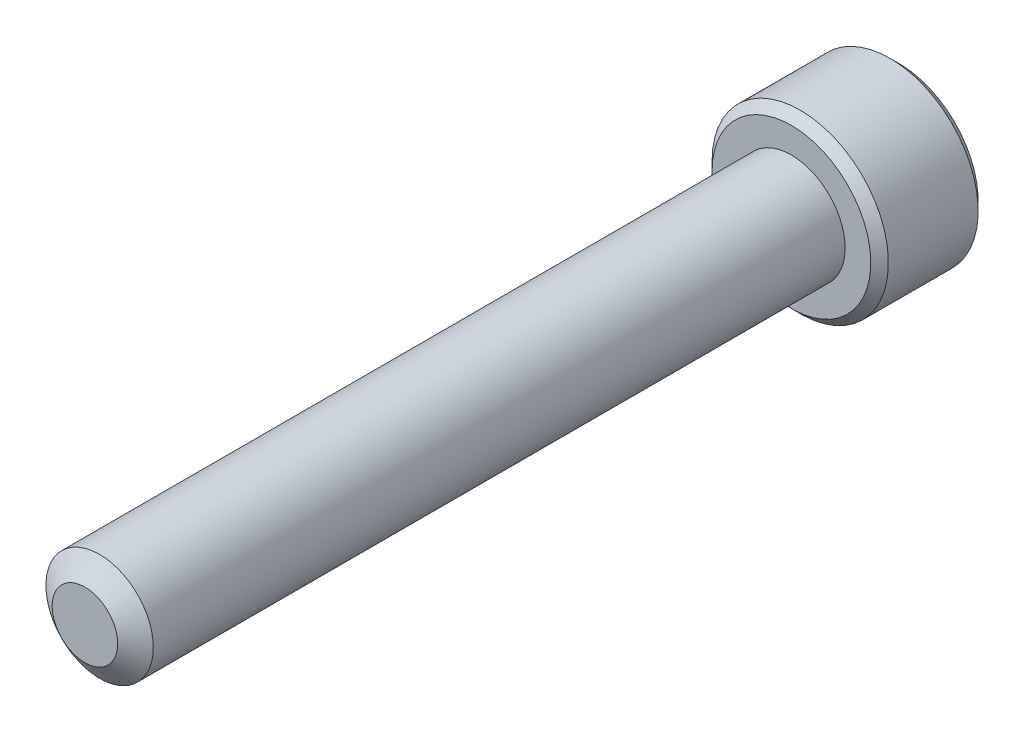
ISO-10303-21;
HEADER;
FILE_DESCRIPTION(('STEP AP214'),'2;1');
FILE_NAME('part.step','',(''),(''),'','','');
FILE_SCHEMA(('AUTOMOTIVE_DESIGN { 1 0 10303 214 1 1 1 1 }'));
ENDSEC;
DATA;
#1=APPLICATION_CONTEXT('core data for automotive mechanical design processes');
#2=APPLICATION_PROTOCOL_DEFINITION('international standard','automotive_design',2000,#1);
#3=PRODUCT_CONTEXT('',#1,'mechanical');
#4=PRODUCT('Part','Part','',(#3));
#5=PRODUCT_RELATED_PRODUCT_CATEGORY('part','',(#4));
#6=PRODUCT_DEFINITION_FORMATION('','',#4);
#7=PRODUCT_DEFINITION_CONTEXT('part definition',#1,'design');
#8=PRODUCT_DEFINITION('design','',#6,#7);
#9=PRODUCT_DEFINITION_SHAPE('','',#8);
#10=(LENGTH_UNIT() NAMED_UNIT(*) SI_UNIT(.MILLI.,.METRE.));
#11=(NAMED_UNIT(*) PLANE_ANGLE_UNIT() SI_UNIT($,.RADIAN.));
#12=(NAMED_UNIT(*) SI_UNIT($,.STERADIAN.) SOLID_ANGLE_UNIT());
#13=UNCERTAINTY_MEASURE_WITH_UNIT(LENGTH_MEASURE(1.E-05),#10,'distance_accuracy_value','');
#14=(GEOMETRIC_REPRESENTATION_CONTEXT(3) GLOBAL_UNCERTAINTY_ASSIGNED_CONTEXT((#13)) GLOBAL_UNIT_ASSIGNED_CONTEXT((#10,
#11,#12)) REPRESENTATION_CONTEXT('',''));
#15=CARTESIAN_POINT('',(0.,0.,0.));
#16=DIRECTION('',(0.,0.,1.));
#17=DIRECTION('',(1.,0.,0.));
#18=AXIS2_PLACEMENT_3D('',#15,#16,#17);
#19=CARTESIAN_POINT('',(0.,0.,-31.75));
#20=DIRECTION('',(0.,0.,1.));
#21=DIRECTION('',(1.,0.,0.));
#22=AXIS2_PLACEMENT_3D('',#19,#20,#21);
#23=CYLINDRICAL_SURFACE('',#22,2.413);
#24=CARTESIAN_POINT('',(0.,0.,-31.75));
#25=DIRECTION('',(0.,0.,-1.));
#26=DIRECTION('',(-1.,0.,0.));
#27=AXIS2_PLACEMENT_3D('',#24,#25,#26);
#28=CIRCLE('',#27,2.413);
#29=CARTESIAN_POINT('',(-2.413,0.,-31.75));
#30=VERTEX_POINT('',#29);
#31=EDGE_CURVE('E216',#30,#30,#28,.F.);
#32=ORIENTED_EDGE('',*,*,#31,.T.);
#33=EDGE_LOOP('',(#32));
#34=FACE_BOUND('',#33,.T.);
#35=CARTESIAN_POINT('',(0.,0.,-0.659180743038974));
#36=DIRECTION('',(0.,0.,1.));
#37=DIRECTION('',(1.,0.,0.));
#38=AXIS2_PLACEMENT_3D('',#35,#36,#37);
#39=CIRCLE('',#38,2.413);
#40=CARTESIAN_POINT('',(2.413,0.,-0.659180743038974));
#41=VERTEX_POINT('',#40);
#42=EDGE_CURVE('E110',#41,#41,#39,.T.);
#43=ORIENTED_EDGE('',*,*,#42,.F.);
#44=EDGE_LOOP('',(#43));
#45=FACE_BOUND('',#44,.T.);
#46=ADVANCED_FACE('F36',(#34,#45),#23,.T.);
#47=CARTESIAN_POINT('',(0.,0.,0.));
#48=DIRECTION('',(0.,0.,-1.));
#49=DIRECTION('',(-1.,0.,0.));
#50=AXIS2_PLACEMENT_3D('',#47,#48,#49);
#51=CONICAL_SURFACE('',#50,1.4715923357461,0.959931088596884);
#52=ORIENTED_EDGE('',*,*,#42,.T.);
#53=EDGE_LOOP('',(#52));
#54=FACE_BOUND('',#53,.T.);
#55=CARTESIAN_POINT('',(0.,0.,0.));
#56=DIRECTION('',(0.,0.,1.));
#57=DIRECTION('',(1.,0.,0.));
#58=AXIS2_PLACEMENT_3D('',#55,#56,#57);
#59=CIRCLE('',#58,1.4715923357461);
#60=CARTESIAN_POINT('',(1.4715923357461,0.,0.));
#61=VERTEX_POINT('',#60);
#62=EDGE_CURVE('E214',#61,#61,#59,.T.);
#63=ORIENTED_EDGE('',*,*,#62,.F.);
#64=EDGE_LOOP('',(#63));
#65=FACE_BOUND('',#64,.T.);
#66=ADVANCED_FACE('F197',(#54,#65),#51,.T.);
#67=CARTESIAN_POINT('',(0.,0.,0.));
#68=DIRECTION('',(0.,0.,1.));
#69=DIRECTION('',(1.,0.,0.));
#70=AXIS2_PLACEMENT_3D('',#67,#68,#69);
#71=PLANE('',#70);
#72=ORIENTED_EDGE('',*,*,#62,.T.);
#73=EDGE_LOOP('',(#72));
#74=FACE_BOUND('',#73,.T.);
#75=ADVANCED_FACE('F194',(#74),#71,.T.);
#76=CARTESIAN_POINT('',(0.,0.,-36.576));
#77=DIRECTION('',(0.,0.,1.));
#78=DIRECTION('',(1.,0.,0.));
#79=AXIS2_PLACEMENT_3D('',#76,#77,#78);
#80=CYLINDRICAL_SURFACE('',#79,3.9624);
#81=CARTESIAN_POINT('',(0.,0.,-36.17976));
#82=DIRECTION('',(0.,0.,-1.));
#83=DIRECTION('',(-1.,0.,0.));
#84=AXIS2_PLACEMENT_3D('',#81,#82,#83);
#85=CIRCLE('',#84,3.9624);
#86=CARTESIAN_POINT('',(-3.9624,0.,-36.17976));
#87=VERTEX_POINT('',#86);
#88=EDGE_CURVE('E44',#87,#87,#85,.F.);
#89=ORIENTED_EDGE('',*,*,#88,.T.);
#90=EDGE_LOOP('',(#89));
#91=FACE_BOUND('',#90,.T.);
#92=CARTESIAN_POINT('',(0.,0.,-32.14624));
#93=DIRECTION('',(0.,0.,-1.));
#94=DIRECTION('',(-1.,0.,0.));
#95=AXIS2_PLACEMENT_3D('',#92,#93,#94);
#96=CIRCLE('',#95,3.9624);
#97=CARTESIAN_POINT('',(-3.9624,0.,-32.14624));
#98=VERTEX_POINT('',#97);
#99=EDGE_CURVE('E173',#98,#98,#96,.T.);
#100=ORIENTED_EDGE('',*,*,#99,.T.);
#101=EDGE_LOOP('',(#100));
#102=FACE_BOUND('',#101,.T.);
#103=ADVANCED_FACE('F178',(#91,#102),#80,.T.);
#104=CARTESIAN_POINT('',(0.,0.,-36.576));
#105=DIRECTION('',(0.,0.,-1.));
#106=DIRECTION('',(-1.,0.,0.));
#107=AXIS2_PLACEMENT_3D('',#104,#105,#106);
#108=PLANE('',#107);
#109=CARTESIAN_POINT('',(0.,0.,-36.576));
#110=DIRECTION('',(0.,0.,-1.));
#111=DIRECTION('',(-1.,0.,0.));
#112=AXIS2_PLACEMENT_3D('',#109,#110,#111);
#113=CIRCLE('',#112,3.56616);
#114=CARTESIAN_POINT('',(-3.56616,0.,-36.576));
#115=VERTEX_POINT('',#114);
#116=EDGE_CURVE('E109',#115,#115,#113,.T.);
#117=ORIENTED_EDGE('',*,*,#116,.T.);
#118=EDGE_LOOP('',(#117));
#119=FACE_BOUND('',#118,.T.);
#120=CARTESIAN_POINT('',(0.,0.,-36.576));
#121=DIRECTION('',(0.,0.,-1.));
#122=DIRECTION('',(-1.,0.,0.));
#123=AXIS2_PLACEMENT_3D('',#120,#121,#122);
#124=CIRCLE('',#123,2.29135888084633);
#125=CARTESIAN_POINT('',(-1.984375,1.14567944042316,-36.576));
#126=VERTEX_POINT('',#125);
#127=CARTESIAN_POINT('',(0.,2.29135888084633,-36.576));
#128=VERTEX_POINT('',#127);
#129=EDGE_CURVE('E90',#126,#128,#124,.T.);
#130=ORIENTED_EDGE('',*,*,#129,.F.);
#131=CARTESIAN_POINT('',(-1.984375,-1.14567944042316,-36.576));
#132=VERTEX_POINT('',#131);
#133=EDGE_CURVE('E50',#132,#126,#124,.T.);
#134=ORIENTED_EDGE('',*,*,#133,.F.);
#135=CARTESIAN_POINT('',(0.,-2.29135888084633,-36.576));
#136=VERTEX_POINT('',#135);
#137=EDGE_CURVE('E275',#136,#132,#124,.T.);
#138=ORIENTED_EDGE('',*,*,#137,.F.);
#139=CARTESIAN_POINT('',(1.984375,-1.14567944042316,-36.576));
#140=VERTEX_POINT('',#139);
#141=EDGE_CURVE('E57',#140,#136,#124,.T.);
#142=ORIENTED_EDGE('',*,*,#141,.F.);
#143=CARTESIAN_POINT('',(1.984375,1.14567944042316,-36.576));
#144=VERTEX_POINT('',#143);
#145=EDGE_CURVE('E131',#144,#140,#124,.T.);
#146=ORIENTED_EDGE('',*,*,#145,.F.);
#147=EDGE_CURVE('E99',#128,#144,#124,.T.);
#148=ORIENTED_EDGE('',*,*,#147,.F.);
#149=EDGE_LOOP('',(#130,#134,#138,#142,#146,#148));
#150=FACE_BOUND('',#149,.T.);
#151=ADVANCED_FACE('F130',(#119,#150),#108,.T.);
#152=CARTESIAN_POINT('',(0.,0.,-31.75));
#153=DIRECTION('',(0.,0.,-1.));
#154=DIRECTION('',(-1.,0.,0.));
#155=AXIS2_PLACEMENT_3D('',#152,#153,#154);
#156=PLANE('',#155);
#157=CARTESIAN_POINT('',(0.,0.,-31.75));
#158=DIRECTION('',(0.,0.,-1.));
#159=DIRECTION('',(-1.,0.,0.));
#160=AXIS2_PLACEMENT_3D('',#157,#158,#159);
#161=CIRCLE('',#160,3.56616);
#162=CARTESIAN_POINT('',(-3.56616,0.,-31.75));
#163=VERTEX_POINT('',#162);
#164=EDGE_CURVE('E11',#163,#163,#161,.F.);
#165=ORIENTED_EDGE('',*,*,#164,.T.);
#166=EDGE_LOOP('',(#165));
#167=FACE_BOUND('',#166,.T.);
#168=ORIENTED_EDGE('',*,*,#31,.F.);
#169=EDGE_LOOP('',(#168));
#170=FACE_BOUND('',#169,.T.);
#171=ADVANCED_FACE('F187',(#167,#170),#156,.F.);
#172=CARTESIAN_POINT('',(0.,0.,-36.576));
#173=DIRECTION('',(0.,0.,-1.));
#174=DIRECTION('',(-1.,0.,0.));
#175=AXIS2_PLACEMENT_3D('',#172,#173,#174);
#176=CONICAL_SURFACE('',#175,2.29135888084633,0.78539816339745);
#177=ORIENTED_EDGE('',*,*,#147,.T.);
#178=CARTESIAN_POINT('',(-0.000199999999999152,2.29147435090016,-36.5761154787818));
#179=CARTESIAN_POINT('',(0.0680159951668032,2.25208982772757,-36.5367628522639));
#180=CARTESIAN_POINT('',(0.137372685106966,2.21204672412052,-36.4997213104462));
#181=CARTESIAN_POINT('',(0.278798800452186,2.13039431835551,-36.4318988584233));
#182=CARTESIAN_POINT('',(0.350881678736782,2.08877724917394,-36.4011556890918));
#183=CARTESIAN_POINT('',(0.496233397266004,2.00485839535392,-36.3484918888112));
#184=CARTESIAN_POINT('',(0.56946521248694,1.96257798712286,-36.32643887588));
#185=CARTESIAN_POINT('',(0.71754118259471,1.87708628592063,-36.2924614929439));
#186=CARTESIAN_POINT('',(0.792380812753429,1.83387760530244,-36.2805117560917));
#187=CARTESIAN_POINT('',(0.921360414543821,1.75941119748879,-36.2697300990819));
#188=CARTESIAN_POINT('',(0.975333715772447,1.72824969749539,-36.2681338990591));
#189=CARTESIAN_POINT('',(1.08319211851981,1.66597761963484,-36.2708218388653));
#190=CARTESIAN_POINT('',(1.13707718248553,1.63486706344893,-36.2751080403405));
#191=CARTESIAN_POINT('',(1.24433853824861,1.57293969082547,-36.2893168730135));
#192=CARTESIAN_POINT('',(1.29771419276014,1.54212324232506,-36.2992458104523));
#193=CARTESIAN_POINT('',(1.4035425174089,1.48102323060121,-36.3241950842745));
#194=CARTESIAN_POINT('',(1.45599525797111,1.45073962671789,-36.3392150303895));
#195=CARTESIAN_POINT('',(1.59035733896365,1.37316564308797,-36.3838078516357));
#196=CARTESIAN_POINT('',(1.67143335715833,1.32635638215845,-36.4167429959383));
#197=CARTESIAN_POINT('',(1.79064830672984,1.25752759893191,-36.4723424412022));
#198=CARTESIAN_POINT('',(1.829934924386,1.23484545965257,-36.4918775920519));
#199=CARTESIAN_POINT('',(1.90778036186805,1.18990137536713,-36.5327287381194));
#200=CARTESIAN_POINT('',(1.9463396111017,1.16763918244233,-36.5540436395683));
#201=CARTESIAN_POINT('',(1.984575,1.14556397036933,-36.5761154787818));
#202=B_SPLINE_CURVE_WITH_KNOTS('',3,(#178,#179,#180,#181,#182,#183,#184,#185,#186,#187,#188,
#189,#190,#191,#192,#193,#194,#195,#196,#197,#198,#199,#200,#201),.UNSPECIFIED.,.F.,.F.,(4,2,2,
2,2,2,2,2,2,2,2,4),(0.,0.264339630306623,0.530219665093693,0.791876416371462,1.05287424418109,
1.23963984393201,1.42647091743853,1.61351120244035,1.80053715247541,2.09764209964316,
2.24579179873713,2.39385111134157),.UNSPECIFIED.);
#203=EDGE_CURVE('E104',#128,#144,#202,.T.);
#204=ORIENTED_EDGE('',*,*,#203,.F.);
#205=EDGE_LOOP('',(#177,#204));
#206=FACE_BOUND('',#205,.T.);
#207=ADVANCED_FACE('F105',(#206),#176,.F.);
#208=ORIENTED_EDGE('',*,*,#145,.T.);
#209=CARTESIAN_POINT('',(1.984375,-2.28495242157823,-37.3109840788166));
#210=CARTESIAN_POINT('',(1.984375,-2.22931635455402,-37.2689866855508));
#211=CARTESIAN_POINT('',(1.984375,-2.1733687654839,-37.2273960540763));
#212=CARTESIAN_POINT('',(1.984375,-2.06072770258171,-37.1452084614715));
#213=CARTESIAN_POINT('',(1.984375,-2.00403404503435,-37.104611752405));
#214=CARTESIAN_POINT('',(1.984375,-1.88936329173489,-37.0243035031747));
#215=CARTESIAN_POINT('',(1.984375,-1.83137965519348,-36.9846012588133));
#216=CARTESIAN_POINT('',(1.984375,-1.71442802137841,-36.9066851734013));
#217=CARTESIAN_POINT('',(1.984375,-1.65546009407228,-36.8684712271944));
#218=CARTESIAN_POINT('',(1.984375,-1.47005472306036,-36.7522528340136));
#219=CARTESIAN_POINT('',(1.984375,-1.34163909427884,-36.6773478868724));
#220=CARTESIAN_POINT('',(1.984375,-1.0784038470548,-36.5403302154397));
#221=CARTESIAN_POINT('',(1.984375,-0.943607781407426,-36.4781743664824));
#222=CARTESIAN_POINT('',(1.984375,-0.741275100444881,-36.4021325786886));
#223=CARTESIAN_POINT('',(1.984375,-0.676735408881094,-36.380308061326));
#224=CARTESIAN_POINT('',(1.984375,-0.54609811811276,-36.3418404635378));
#225=CARTESIAN_POINT('',(1.984375,-0.480000411919954,-36.3251977400655));
#226=CARTESIAN_POINT('',(1.984375,-0.34774617002853,-36.2982353808697));
#227=CARTESIAN_POINT('',(1.984375,-0.281612071479121,-36.2878074097359));
#228=CARTESIAN_POINT('',(1.984375,-0.148636620052347,-36.2734781473766));
#229=CARTESIAN_POINT('',(1.984375,-0.0817953907393204,-36.2695757342274));
#230=CARTESIAN_POINT('',(1.984375,0.0495156750890684,-36.2685870513327));
#231=CARTESIAN_POINT('',(1.984375,0.113983775102996,-36.271259178875));
#232=CARTESIAN_POINT('',(1.984375,0.242367515846182,-36.2827392104975));
#233=CARTESIAN_POINT('',(1.984375,0.306283102295925,-36.2915477106392));
#234=CARTESIAN_POINT('',(1.984375,0.434181040262189,-36.3149690213329));
#235=CARTESIAN_POINT('',(1.984375,0.498145026858314,-36.3296806062321));
#236=CARTESIAN_POINT('',(1.984375,0.624675616953012,-36.3641261814121));
#237=CARTESIAN_POINT('',(1.984375,0.687242336899693,-36.3838597514492));
#238=CARTESIAN_POINT('',(1.984375,0.884225483826093,-36.4534122372308));
#239=CARTESIAN_POINT('',(1.984375,1.01583674256469,-36.5111524112565));
#240=CARTESIAN_POINT('',(1.984375,1.27288659242653,-36.6395303365888));
#241=CARTESIAN_POINT('',(1.984375,1.39830088270481,-36.7102144249194));
#242=CARTESIAN_POINT('',(1.984375,1.57956687990222,-36.8205166638132));
#243=CARTESIAN_POINT('',(1.984375,1.63738271299424,-36.8569698294754));
#244=CARTESIAN_POINT('',(1.984375,1.75202215386202,-36.9314159632917));
#245=CARTESIAN_POINT('',(1.984375,1.80884568601362,-36.9694090480781));
#246=CARTESIAN_POINT('',(1.984375,1.92116923084256,-37.0463388088931));
#247=CARTESIAN_POINT('',(1.984375,1.97667624512254,-37.0852653130388));
#248=CARTESIAN_POINT('',(1.984375,2.08693170717167,-37.1641477461214));
#249=CARTESIAN_POINT('',(1.984375,2.14168035934793,-37.204103389024));
#250=CARTESIAN_POINT('',(1.984375,2.19611149046623,-37.2444806112854));
#251=B_SPLINE_CURVE_WITH_KNOTS('',3,(#209,#210,#211,#212,#213,#214,#215,#216,#217,#218,#219,
#220,#221,#222,#223,#224,#225,#226,#227,#228,#229,#230,#231,#232,#233,#234,#235,#236,#237,#238,
#239,#240,#241,#242,#243,#244,#245,#246,#247,#248,#249,#250),.UNSPECIFIED.,.F.,.F.,(4,2,2,2,2,2,
2,2,2,2,2,2,2,2,2,2,2,2,2,2,4),(0.,0.20912607000832,0.418304637356568,0.629103979977992,
0.839888401371183,1.28549951116127,1.72957750768351,1.93379389749972,2.13802435186699,
2.33858179514334,2.5391047535064,2.73236963400795,2.92565329006888,3.12231577097488,
3.31896180041346,3.74886295245173,4.18033428125363,4.38536017180291,4.59040161996384,
4.79377749165109,4.99709743524133),.UNSPECIFIED.);
#252=EDGE_CURVE('E98',#144,#140,#251,.F.);
#253=ORIENTED_EDGE('',*,*,#252,.F.);
#254=EDGE_LOOP('',(#208,#253));
#255=FACE_BOUND('',#254,.T.);
#256=ADVANCED_FACE('F281',(#255),#176,.F.);
#257=ORIENTED_EDGE('',*,*,#141,.T.);
#258=CARTESIAN_POINT('',(1.984575,-1.14556397036933,-36.5761154787818));
#259=CARTESIAN_POINT('',(1.9163590048332,-1.18494849354192,-36.5367628522639));
#260=CARTESIAN_POINT('',(1.84700231489303,-1.22499159714897,-36.4997213104462));
#261=CARTESIAN_POINT('',(1.70557619954781,-1.30664400291398,-36.4318988584233));
#262=CARTESIAN_POINT('',(1.63349332126322,-1.34826107209555,-36.4011556890918));
#263=CARTESIAN_POINT('',(1.488141602734,-1.43217992591557,-36.3484918888112));
#264=CARTESIAN_POINT('',(1.41490978751306,-1.47446033414663,-36.32643887588));
#265=CARTESIAN_POINT('',(1.26683381740529,-1.55995203534886,-36.2924614929439));
#266=CARTESIAN_POINT('',(1.19199418724657,-1.60316071596705,-36.2805117560917));
#267=CARTESIAN_POINT('',(1.06301458545618,-1.6776271237807,-36.2697300990819));
#268=CARTESIAN_POINT('',(1.00904128422755,-1.7087886237741,-36.2681338990591));
#269=CARTESIAN_POINT('',(0.901182881480194,-1.77106070163465,-36.2708218388653));
#270=CARTESIAN_POINT('',(0.847297817514472,-1.80217125782056,-36.2751080403405));
#271=CARTESIAN_POINT('',(0.740036461751391,-1.86409863044402,-36.2893168730135));
#272=CARTESIAN_POINT('',(0.686660807239855,-1.89491507894443,-36.2992458104523));
#273=CARTESIAN_POINT('',(0.580832482591099,-1.95601509066828,-36.3241950842745));
#274=CARTESIAN_POINT('',(0.528379742028894,-1.9862986945516,-36.3392150303895));
#275=CARTESIAN_POINT('',(0.394017661036348,-2.06387267818152,-36.3838078516357));
#276=CARTESIAN_POINT('',(0.312941642841674,-2.11068193911104,-36.4167429959383));
#277=CARTESIAN_POINT('',(0.193726693270163,-2.17951072233758,-36.4723424412022));
#278=CARTESIAN_POINT('',(0.154440075614003,-2.20219286161692,-36.4918775920519));
#279=CARTESIAN_POINT('',(0.0765946381319523,-2.24713694590236,-36.5327287381194));
#280=CARTESIAN_POINT('',(0.0380353888983053,-2.26939913882716,-36.5540436395683));
#281=CARTESIAN_POINT('',(-0.000199999999998087,-2.29147435090016,-36.5761154787818));
#282=B_SPLINE_CURVE_WITH_KNOTS('',3,(#258,#259,#260,#261,#262,#263,#264,#265,#266,#267,#268,
#269,#270,#271,#272,#273,#274,#275,#276,#277,#278,#279,#280,#281),.UNSPECIFIED.,.F.,.F.,(4,2,2,
2,2,2,2,2,2,2,2,4),(0.,0.264339630306623,0.530219665093693,0.791876416371462,1.05287424418109,
1.23963984393201,1.42647091743853,1.61351120244035,1.80053715247541,2.09764209964316,
2.24579179873713,2.39385111134157),.UNSPECIFIED.);
#283=EDGE_CURVE('E141',#140,#136,#282,.T.);
#284=ORIENTED_EDGE('',*,*,#283,.F.);
#285=EDGE_LOOP('',(#257,#284));
#286=FACE_BOUND('',#285,.T.);
#287=ADVANCED_FACE('F278',(#286),#176,.F.);
#288=ORIENTED_EDGE('',*,*,#137,.T.);
#289=CARTESIAN_POINT('',(0.000200000000000443,-2.29147435090016,-36.5761154787818));
#290=CARTESIAN_POINT('',(-0.0680159951668036,-2.25208982772757,-36.5367628522639));
#291=CARTESIAN_POINT('',(-0.137372685106967,-2.21204672412052,-36.4997213104462));
#292=CARTESIAN_POINT('',(-0.278798800452188,-2.13039431835551,-36.4318988584233));
#293=CARTESIAN_POINT('',(-0.350881678736781,-2.08877724917394,-36.4011556890918));
#294=CARTESIAN_POINT('',(-0.496233397266002,-2.00485839535392,-36.3484918888112));
#295=CARTESIAN_POINT('',(-0.569465212486937,-1.96257798712287,-36.32643887588));
#296=CARTESIAN_POINT('',(-0.717541182594707,-1.87708628592063,-36.2924614929439));
#297=CARTESIAN_POINT('',(-0.792380812753427,-1.83387760530244,-36.2805117560917));
#298=CARTESIAN_POINT('',(-0.921360414543819,-1.75941119748879,-36.2697300990819));
#299=CARTESIAN_POINT('',(-0.975333715772446,-1.72824969749539,-36.2681338990591));
#300=CARTESIAN_POINT('',(-1.0831921185198,-1.66597761963484,-36.2708218388653));
#301=CARTESIAN_POINT('',(-1.13707718248553,-1.63486706344893,-36.2751080403405));
#302=CARTESIAN_POINT('',(-1.24433853824861,-1.57293969082547,-36.2893168730135));
#303=CARTESIAN_POINT('',(-1.29771419276014,-1.54212324232506,-36.2992458104523));
#304=CARTESIAN_POINT('',(-1.4035425174089,-1.48102323060121,-36.3241950842745));
#305=CARTESIAN_POINT('',(-1.45599525797111,-1.45073962671789,-36.3392150303895));
#306=CARTESIAN_POINT('',(-1.59035733896365,-1.37316564308797,-36.3838078516357));
#307=CARTESIAN_POINT('',(-1.67143335715833,-1.32635638215845,-36.4167429959383));
#308=CARTESIAN_POINT('',(-1.79064830672984,-1.25752759893191,-36.4723424412022));
#309=CARTESIAN_POINT('',(-1.829934924386,-1.23484545965257,-36.4918775920519));
#310=CARTESIAN_POINT('',(-1.90778036186806,-1.18990137536712,-36.5327287381194));
#311=CARTESIAN_POINT('',(-1.9463396111017,-1.16763918244233,-36.5540436395683));
#312=CARTESIAN_POINT('',(-1.984575,-1.14556397036933,-36.5761154787818));
#313=B_SPLINE_CURVE_WITH_KNOTS('',3,(#289,#290,#291,#292,#293,#294,#295,#296,#297,#298,#299,
#300,#301,#302,#303,#304,#305,#306,#307,#308,#309,#310,#311,#312),.UNSPECIFIED.,.F.,.F.,(4,2,2,
2,2,2,2,2,2,2,2,4),(0.,0.264339630306627,0.530219665093692,0.791876416371459,1.05287424418109,
1.239639843932,1.42647091743853,1.61351120244035,1.80053715247541,2.09764209964317,
2.24579179873714,2.39385111134157),.UNSPECIFIED.);
#314=EDGE_CURVE('E252',#136,#132,#313,.T.);
#315=ORIENTED_EDGE('',*,*,#314,.F.);
#316=EDGE_LOOP('',(#288,#315));
#317=FACE_BOUND('',#316,.T.);
#318=ADVANCED_FACE('F277',(#317),#176,.F.);
#319=ORIENTED_EDGE('',*,*,#133,.T.);
#320=CARTESIAN_POINT('',(-1.984375,-2.28495242191067,-37.3109840790676));
#321=CARTESIAN_POINT('',(-1.984375,-2.22931635487714,-37.2689866857921));
#322=CARTESIAN_POINT('',(-1.984375,-2.17336876579766,-37.227396054308));
#323=CARTESIAN_POINT('',(-1.984375,-2.06072770287667,-37.1452084616839));
#324=CARTESIAN_POINT('',(-1.984375,-2.00403404531986,-37.1046117526079));
#325=CARTESIAN_POINT('',(-1.984375,-1.88936329200117,-37.0243035033582));
#326=CARTESIAN_POINT('',(-1.984375,-1.83137965545,-36.9846012589872));
#327=CARTESIAN_POINT('',(-1.984375,-1.71442802161519,-36.906685173556));
#328=CARTESIAN_POINT('',(-1.984375,-1.65546009429912,-36.8684712273396));
#329=CARTESIAN_POINT('',(-1.984375,-1.47005472325436,-36.7522528341287));
#330=CARTESIAN_POINT('',(-1.984375,-1.34163909444949,-36.6773478869673));
#331=CARTESIAN_POINT('',(-1.984375,-1.07840384717678,-36.5403302154972));
#332=CARTESIAN_POINT('',(-1.984375,-0.943607781504097,-36.4781743665226));
#333=CARTESIAN_POINT('',(-1.984375,-0.741275100522508,-36.402132578716));
#334=CARTESIAN_POINT('',(-1.984375,-0.676735408966696,-36.3803080613539));
#335=CARTESIAN_POINT('',(-1.984375,-0.546098118214574,-36.3418404635651));
#336=CARTESIAN_POINT('',(-1.984375,-0.480000412030006,-36.3251977400917));
#337=CARTESIAN_POINT('',(-1.984375,-0.347746170154783,-36.2982353808918));
#338=CARTESIAN_POINT('',(-1.984375,-0.281612071613335,-36.287807409755));
#339=CARTESIAN_POINT('',(-1.984375,-0.148636620202217,-36.2734781473881));
#340=CARTESIAN_POINT('',(-1.984375,-0.0817953908968854,-36.2695757342341));
#341=CARTESIAN_POINT('',(-1.984375,0.0495156749173055,-36.2685870513286));
#342=CARTESIAN_POINT('',(-1.984375,0.11398377492471,-36.271259178865));
#343=CARTESIAN_POINT('',(-1.984375,0.242367515655504,-36.2827392104746));
#344=CARTESIAN_POINT('',(-1.984375,0.306283102099377,-36.2915477106094));
#345=CARTESIAN_POINT('',(-1.984375,0.434181040054054,-36.3149690212885));
#346=CARTESIAN_POINT('',(-1.984375,0.49814502664448,-36.3296806061801));
#347=CARTESIAN_POINT('',(-1.984375,0.624675616728327,-36.3641261813447));
#348=CARTESIAN_POINT('',(-1.984375,0.687242336669859,-36.383859751374));
#349=CARTESIAN_POINT('',(-1.984375,0.884225483546214,-36.4534122371188));
#350=CARTESIAN_POINT('',(-1.984375,1.01583674224242,-36.5111524111108));
#351=CARTESIAN_POINT('',(-1.984375,1.27288659202274,-36.6395303363718));
#352=CARTESIAN_POINT('',(-1.984375,1.39830088226191,-36.7102144246649));
#353=CARTESIAN_POINT('',(-1.984375,1.57956687940504,-36.8205166635036));
#354=CARTESIAN_POINT('',(-1.984375,1.63738271248118,-36.8569698291489));
#355=CARTESIAN_POINT('',(-1.984375,1.75202215331742,-36.9314159629313));
#356=CARTESIAN_POINT('',(-1.984375,1.80884568545336,-36.9694090477007));
#357=CARTESIAN_POINT('',(-1.984375,1.92116923025137,-37.0463388084819));
#358=CARTESIAN_POINT('',(-1.984375,1.97667624451607,-37.0852653126108));
#359=CARTESIAN_POINT('',(-1.984375,2.08693170653474,-37.1641477456598));
#360=CARTESIAN_POINT('',(-1.984375,2.14168035869582,-37.2041033885457));
#361=CARTESIAN_POINT('',(-1.984375,2.19611148979895,-37.2444806107903));
#362=B_SPLINE_CURVE_WITH_KNOTS('',3,(#320,#321,#322,#323,#324,#325,#326,#327,#328,#329,#330,
#331,#332,#333,#334,#335,#336,#337,#338,#339,#340,#341,#342,#343,#344,#345,#346,#347,#348,#349,
#350,#351,#352,#353,#354,#355,#356,#357,#358,#359,#360,#361),.UNSPECIFIED.,.F.,.F.,(4,2,2,2,2,2,
2,2,2,2,2,2,2,2,2,2,2,2,2,2,4),(0.,0.209126070048124,0.418304637436187,0.629103980098172,
0.839888401531927,1.28549951141299,1.72957750802534,1.93379389781848,2.13802435216272,
2.33858179541699,2.53910475375796,2.7323696342393,2.92565329027999,3.12231577116423,
3.31896180058103,3.74886295246282,4.1803342811072,4.38536017158909,4.59040161968263,
4.79377749130341,4.99709743482718),.UNSPECIFIED.);
#363=EDGE_CURVE('E120',#132,#126,#362,.T.);
#364=ORIENTED_EDGE('',*,*,#363,.F.);
#365=EDGE_LOOP('',(#319,#364));
#366=FACE_BOUND('',#365,.T.);
#367=ADVANCED_FACE('F290',(#366),#176,.F.);
#368=ORIENTED_EDGE('',*,*,#129,.T.);
#369=CARTESIAN_POINT('',(-1.984575,1.14556397036933,-36.5761154787818));
#370=CARTESIAN_POINT('',(-1.9163590048332,1.18494849354192,-36.5367628522639));
#371=CARTESIAN_POINT('',(-1.84700231489303,1.22499159714897,-36.4997213104462));
#372=CARTESIAN_POINT('',(-1.70557619954781,1.30664400291398,-36.4318988584233));
#373=CARTESIAN_POINT('',(-1.63349332126321,1.34826107209555,-36.4011556890917));
#374=CARTESIAN_POINT('',(-1.48814160273399,1.43217992591558,-36.3484918888112));
#375=CARTESIAN_POINT('',(-1.41490978751306,1.47446033414663,-36.32643887588));
#376=CARTESIAN_POINT('',(-1.26683381740529,1.55995203534886,-36.2924614929439));
#377=CARTESIAN_POINT('',(-1.19199418724657,1.60316071596705,-36.2805117560917));
#378=CARTESIAN_POINT('',(-1.06301458545618,1.6776271237807,-36.2697300990819));
#379=CARTESIAN_POINT('',(-1.00904128422755,1.7087886237741,-36.2681338990591));
#380=CARTESIAN_POINT('',(-0.901182881480194,1.77106070163465,-36.2708218388653));
#381=CARTESIAN_POINT('',(-0.847297817514471,1.80217125782056,-36.2751080403405));
#382=CARTESIAN_POINT('',(-0.740036461751391,1.86409863044402,-36.2893168730135));
#383=CARTESIAN_POINT('',(-0.686660807239855,1.89491507894443,-36.2992458104523));
#384=CARTESIAN_POINT('',(-0.580832482591099,1.95601509066828,-36.3241950842745));
#385=CARTESIAN_POINT('',(-0.528379742028894,1.9862986945516,-36.3392150303895));
#386=CARTESIAN_POINT('',(-0.394017661036348,2.06387267818152,-36.3838078516357));
#387=CARTESIAN_POINT('',(-0.312941642841674,2.11068193911104,-36.4167429959383));
#388=CARTESIAN_POINT('',(-0.193726693270161,2.17951072233758,-36.4723424412022));
#389=CARTESIAN_POINT('',(-0.154440075613999,2.20219286161692,-36.4918775920519));
#390=CARTESIAN_POINT('',(-0.0765946381319473,2.24713694590236,-36.5327287381194));
#391=CARTESIAN_POINT('',(-0.0380353888983017,2.26939913882716,-36.5540436395683));
#392=CARTESIAN_POINT('',(0.000199999999999549,2.29147435090016,-36.5761154787818));
#393=B_SPLINE_CURVE_WITH_KNOTS('',3,(#369,#370,#371,#372,#373,#374,#375,#376,#377,#378,#379,
#380,#381,#382,#383,#384,#385,#386,#387,#388,#389,#390,#391,#392),.UNSPECIFIED.,.F.,.F.,(4,2,2,
2,2,2,2,2,2,2,2,4),(0.,0.26433963030663,0.530219665093698,0.791876416371464,1.0528742441811,
1.23963984393201,1.42647091743853,1.61351120244035,1.80053715247541,2.09764209964316,
2.24579179873714,2.39385111134157),.UNSPECIFIED.);
#394=EDGE_CURVE('E94',#126,#128,#393,.T.);
#395=ORIENTED_EDGE('',*,*,#394,.F.);
#396=EDGE_LOOP('',(#368,#395));
#397=FACE_BOUND('',#396,.T.);
#398=ADVANCED_FACE('F92',(#397),#176,.F.);
#399=CARTESIAN_POINT('',(1.984375,3.43703832126949,-33.5994375));
#400=DIRECTION('',(0.,0.,-1.));
#401=DIRECTION('',(-1.,0.,0.));
#402=AXIS2_PLACEMENT_3D('',#399,#400,#401);
#403=PLANE('',#402);
#404=DIRECTION('',(0.866025403784439,0.5,0.));
#405=VECTOR('',#404,1.);
#406=CARTESIAN_POINT('',(-1.984375,1.14567944042316,-33.5994375));
#407=LINE('',#406,#405);
#408=CARTESIAN_POINT('',(-1.984375,1.14567944042316,-33.5994375));
#409=VERTEX_POINT('',#408);
#410=CARTESIAN_POINT('',(0.,2.29135888084633,-33.5994375));
#411=VERTEX_POINT('',#410);
#412=EDGE_CURVE('E119',#409,#411,#407,.T.);
#413=ORIENTED_EDGE('',*,*,#412,.T.);
#414=DIRECTION('',(0.866025403784439,-0.5,0.));
#415=VECTOR('',#414,1.);
#416=CARTESIAN_POINT('',(0.,2.29135888084633,-33.5994375));
#417=LINE('',#416,#415);
#418=CARTESIAN_POINT('',(1.984375,1.14567944042316,-33.5994375));
#419=VERTEX_POINT('',#418);
#420=EDGE_CURVE('E124',#411,#419,#417,.T.);
#421=ORIENTED_EDGE('',*,*,#420,.T.);
#422=DIRECTION('',(0.,-1.,0.));
#423=VECTOR('',#422,1.);
#424=CARTESIAN_POINT('',(1.984375,1.14567944042316,-33.5994375));
#425=LINE('',#424,#423);
#426=CARTESIAN_POINT('',(1.984375,-1.14567944042316,-33.5994375));
#427=VERTEX_POINT('',#426);
#428=EDGE_CURVE('E238',#419,#427,#425,.T.);
#429=ORIENTED_EDGE('',*,*,#428,.T.);
#430=DIRECTION('',(-0.866025403784439,-0.5,0.));
#431=VECTOR('',#430,1.);
#432=CARTESIAN_POINT('',(1.984375,-1.14567944042316,-33.5994375));
#433=LINE('',#432,#431);
#434=CARTESIAN_POINT('',(0.,-2.29135888084633,-33.5994375));
#435=VERTEX_POINT('',#434);
#436=EDGE_CURVE('E235',#427,#435,#433,.T.);
#437=ORIENTED_EDGE('',*,*,#436,.T.);
#438=DIRECTION('',(-0.866025403784439,0.5,0.));
#439=VECTOR('',#438,1.);
#440=CARTESIAN_POINT('',(0.,-2.29135888084633,-33.5994375));
#441=LINE('',#440,#439);
#442=CARTESIAN_POINT('',(-1.984375,-1.14567944042316,-33.5994375));
#443=VERTEX_POINT('',#442);
#444=EDGE_CURVE('E232',#435,#443,#441,.T.);
#445=ORIENTED_EDGE('',*,*,#444,.T.);
#446=DIRECTION('',(0.,1.,0.));
#447=VECTOR('',#446,1.);
#448=CARTESIAN_POINT('',(-1.984375,-1.14567944042316,-33.5994375));
#449=LINE('',#448,#447);
#450=EDGE_CURVE('E127',#443,#409,#449,.T.);
#451=ORIENTED_EDGE('',*,*,#450,.T.);
#452=EDGE_LOOP('',(#413,#421,#429,#437,#445,#451));
#453=FACE_BOUND('',#452,.T.);
#454=ADVANCED_FACE('F161',(#453),#403,.T.);
#455=CARTESIAN_POINT('',(0.,2.29135888084633,-33.5994375));
#456=DIRECTION('',(0.5,0.866025403784439,0.));
#457=DIRECTION('',(-0.866025403784439,0.5,0.));
#458=AXIS2_PLACEMENT_3D('',#455,#456,#457);
#459=PLANE('',#458);
#460=DIRECTION('',(0.,0.,-1.));
#461=VECTOR('',#460,1.);
#462=CARTESIAN_POINT('',(0.,2.29135888084633,-33.5994375));
#463=LINE('',#462,#461);
#464=EDGE_CURVE('E116',#411,#128,#463,.T.);
#465=ORIENTED_EDGE('',*,*,#464,.T.);
#466=ORIENTED_EDGE('',*,*,#203,.T.);
#467=DIRECTION('',(0.,0.,-1.));
#468=VECTOR('',#467,1.);
#469=CARTESIAN_POINT('',(1.984375,1.14567944042316,-33.5994375));
#470=LINE('',#469,#468);
#471=EDGE_CURVE('E126',#419,#144,#470,.T.);
#472=ORIENTED_EDGE('',*,*,#471,.F.);
#473=ORIENTED_EDGE('',*,*,#420,.F.);
#474=EDGE_LOOP('',(#465,#466,#472,#473));
#475=FACE_BOUND('',#474,.T.);
#476=ADVANCED_FACE('F122',(#475),#459,.F.);
#477=CARTESIAN_POINT('',(1.984375,1.14567944042316,-33.5994375));
#478=DIRECTION('',(1.,0.,0.));
#479=DIRECTION('',(0.,0.,-1.));
#480=AXIS2_PLACEMENT_3D('',#477,#478,#479);
#481=PLANE('',#480);
#482=ORIENTED_EDGE('',*,*,#471,.T.);
#483=ORIENTED_EDGE('',*,*,#252,.T.);
#484=DIRECTION('',(0.,0.,-1.));
#485=VECTOR('',#484,1.);
#486=CARTESIAN_POINT('',(1.984375,-1.14567944042316,-33.5994375));
#487=LINE('',#486,#485);
#488=EDGE_CURVE('E221',#427,#140,#487,.T.);
#489=ORIENTED_EDGE('',*,*,#488,.F.);
#490=ORIENTED_EDGE('',*,*,#428,.F.);
#491=EDGE_LOOP('',(#482,#483,#489,#490));
#492=FACE_BOUND('',#491,.T.);
#493=ADVANCED_FACE('F150',(#492),#481,.F.);
#494=CARTESIAN_POINT('',(1.984375,-1.14567944042316,-33.5994375));
#495=DIRECTION('',(0.5,-0.866025403784439,0.));
#496=DIRECTION('',(0.866025403784439,0.5,0.));
#497=AXIS2_PLACEMENT_3D('',#494,#495,#496);
#498=PLANE('',#497);
#499=ORIENTED_EDGE('',*,*,#488,.T.);
#500=ORIENTED_EDGE('',*,*,#283,.T.);
#501=DIRECTION('',(0.,0.,-1.));
#502=VECTOR('',#501,1.);
#503=CARTESIAN_POINT('',(0.,-2.29135888084633,-33.5994375));
#504=LINE('',#503,#502);
#505=EDGE_CURVE('E224',#435,#136,#504,.T.);
#506=ORIENTED_EDGE('',*,*,#505,.F.);
#507=ORIENTED_EDGE('',*,*,#436,.F.);
#508=EDGE_LOOP('',(#499,#500,#506,#507));
#509=FACE_BOUND('',#508,.T.);
#510=ADVANCED_FACE('F154',(#509),#498,.F.);
#511=CARTESIAN_POINT('',(0.,-2.29135888084633,-33.5994375));
#512=DIRECTION('',(-0.5,-0.866025403784439,0.));
#513=DIRECTION('',(0.866025403784439,-0.5,0.));
#514=AXIS2_PLACEMENT_3D('',#511,#512,#513);
#515=PLANE('',#514);
#516=ORIENTED_EDGE('',*,*,#505,.T.);
#517=ORIENTED_EDGE('',*,*,#314,.T.);
#518=DIRECTION('',(0.,0.,-1.));
#519=VECTOR('',#518,1.);
#520=CARTESIAN_POINT('',(-1.984375,-1.14567944042316,-33.5994375));
#521=LINE('',#520,#519);
#522=EDGE_CURVE('E227',#443,#132,#521,.T.);
#523=ORIENTED_EDGE('',*,*,#522,.F.);
#524=ORIENTED_EDGE('',*,*,#444,.F.);
#525=EDGE_LOOP('',(#516,#517,#523,#524));
#526=FACE_BOUND('',#525,.T.);
#527=ADVANCED_FACE('F260',(#526),#515,.F.);
#528=CARTESIAN_POINT('',(-1.984375,-1.14567944042316,-33.5994375));
#529=DIRECTION('',(-1.,0.,0.));
#530=DIRECTION('',(0.,-1.,0.));
#531=AXIS2_PLACEMENT_3D('',#528,#529,#530);
#532=PLANE('',#531);
#533=ORIENTED_EDGE('',*,*,#522,.T.);
#534=ORIENTED_EDGE('',*,*,#363,.T.);
#535=DIRECTION('',(0.,0.,-1.));
#536=VECTOR('',#535,1.);
#537=CARTESIAN_POINT('',(-1.984375,1.14567944042316,-33.5994375));
#538=LINE('',#537,#536);
#539=EDGE_CURVE('E118',#409,#126,#538,.T.);
#540=ORIENTED_EDGE('',*,*,#539,.F.);
#541=ORIENTED_EDGE('',*,*,#450,.F.);
#542=EDGE_LOOP('',(#533,#534,#540,#541));
#543=FACE_BOUND('',#542,.T.);
#544=ADVANCED_FACE('F257',(#543),#532,.F.);
#545=CARTESIAN_POINT('',(-1.984375,1.14567944042316,-33.5994375));
#546=DIRECTION('',(-0.5,0.866025403784439,0.));
#547=DIRECTION('',(-0.866025403784439,-0.5,0.));
#548=AXIS2_PLACEMENT_3D('',#545,#546,#547);
#549=PLANE('',#548);
#550=ORIENTED_EDGE('',*,*,#539,.T.);
#551=ORIENTED_EDGE('',*,*,#394,.T.);
#552=ORIENTED_EDGE('',*,*,#464,.F.);
#553=ORIENTED_EDGE('',*,*,#412,.F.);
#554=EDGE_LOOP('',(#550,#551,#552,#553));
#555=FACE_BOUND('',#554,.T.);
#556=ADVANCED_FACE('F114',(#555),#549,.F.);
#557=CARTESIAN_POINT('',(0.,0.,-36.576));
#558=DIRECTION('',(0.,0.,1.));
#559=DIRECTION('',(1.,0.,0.));
#560=AXIS2_PLACEMENT_3D('',#557,#558,#559);
#561=CONICAL_SURFACE('',#560,3.56616,0.785398163397437);
#562=ORIENTED_EDGE('',*,*,#88,.F.);
#563=EDGE_LOOP('',(#562));
#564=FACE_BOUND('',#563,.T.);
#565=ORIENTED_EDGE('',*,*,#116,.F.);
#566=EDGE_LOOP('',(#565));
#567=FACE_BOUND('',#566,.T.);
#568=ADVANCED_FACE('F181',(#564,#567),#561,.T.);
#569=CARTESIAN_POINT('',(0.,0.,-32.14624));
#570=DIRECTION('',(0.,0.,-1.));
#571=DIRECTION('',(-1.,0.,0.));
#572=AXIS2_PLACEMENT_3D('',#569,#570,#571);
#573=CONICAL_SURFACE('',#572,3.9624,0.78539816339745);
#574=ORIENTED_EDGE('',*,*,#164,.F.);
#575=EDGE_LOOP('',(#574));
#576=FACE_BOUND('',#575,.T.);
#577=ORIENTED_EDGE('',*,*,#99,.F.);
#578=EDGE_LOOP('',(#577));
#579=FACE_BOUND('',#578,.T.);
#580=ADVANCED_FACE('F38',(#576,#579),#573,.T.);
#581=CLOSED_SHELL('',(#46,#66,#75,#103,#151,#171,#207,#256,#287,#318,#367,#398,#454,#476,#493,
#510,#527,#544,#556,#568,#580));
#582=MANIFOLD_SOLID_BREP('B2',#581);
#583=ADVANCED_BREP_SHAPE_REPRESENTATION('',(#18,#582),#14);
#584=SHAPE_DEFINITION_REPRESENTATION(#9,#583);
ENDSEC;
END-ISO-10303-21;
